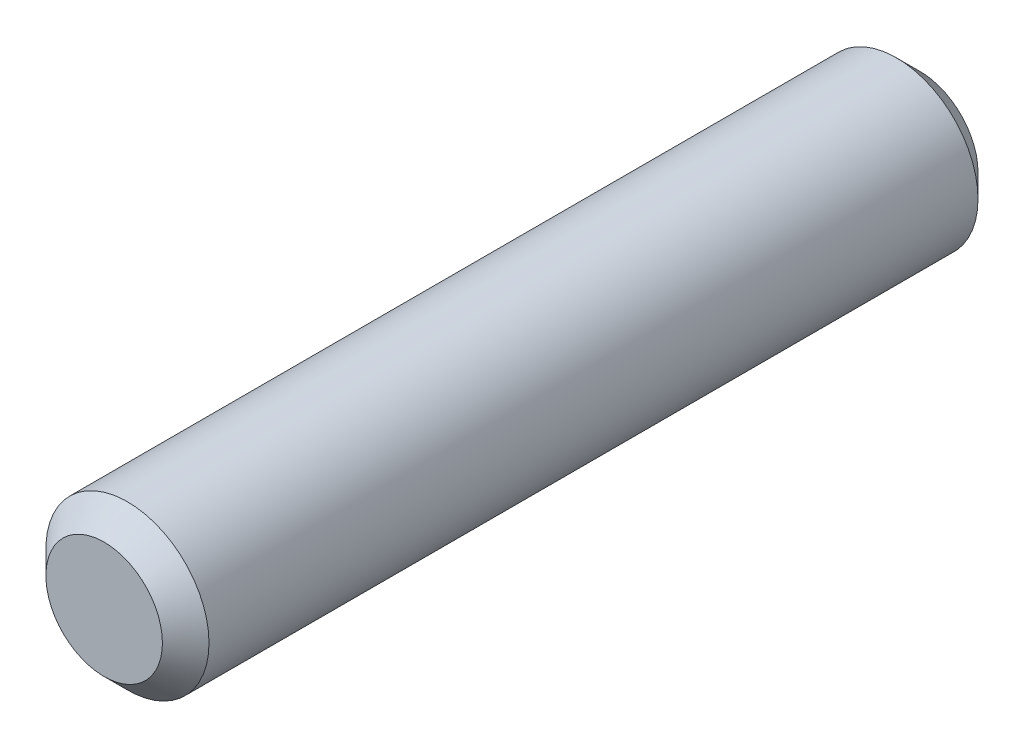
ISO-10303-21;
HEADER;
FILE_DESCRIPTION(('STEP AP214'),'2;1');
FILE_NAME('part.step','',(''),(''),'','','');
FILE_SCHEMA(('AUTOMOTIVE_DESIGN { 1 0 10303 214 1 1 1 1 }'));
ENDSEC;
DATA;
#1=APPLICATION_CONTEXT('core data for automotive mechanical design processes');
#2=APPLICATION_PROTOCOL_DEFINITION('international standard','automotive_design',2000,#1);
#3=PRODUCT_CONTEXT('',#1,'mechanical');
#4=PRODUCT('Part','Part','',(#3));
#5=PRODUCT_RELATED_PRODUCT_CATEGORY('part','',(#4));
#6=PRODUCT_DEFINITION_FORMATION('','',#4);
#7=PRODUCT_DEFINITION_CONTEXT('part definition',#1,'design');
#8=PRODUCT_DEFINITION('design','',#6,#7);
#9=PRODUCT_DEFINITION_SHAPE('','',#8);
#10=(LENGTH_UNIT() NAMED_UNIT(*) SI_UNIT(.MILLI.,.METRE.));
#11=(NAMED_UNIT(*) PLANE_ANGLE_UNIT() SI_UNIT($,.RADIAN.));
#12=(NAMED_UNIT(*) SI_UNIT($,.STERADIAN.) SOLID_ANGLE_UNIT());
#13=UNCERTAINTY_MEASURE_WITH_UNIT(LENGTH_MEASURE(1.E-05),#10,'distance_accuracy_value','');
#14=(GEOMETRIC_REPRESENTATION_CONTEXT(3) GLOBAL_UNCERTAINTY_ASSIGNED_CONTEXT((#13)) GLOBAL_UNIT_ASSIGNED_CONTEXT((#10,
#11,#12)) REPRESENTATION_CONTEXT('',''));
#15=CARTESIAN_POINT('',(0.,0.,0.));
#16=DIRECTION('',(0.,0.,1.));
#17=DIRECTION('',(1.,0.,0.));
#18=AXIS2_PLACEMENT_3D('',#15,#16,#17);
#19=CARTESIAN_POINT('',(0.,0.,70.));
#20=DIRECTION('',(0.,0.,-1.));
#21=DIRECTION('',(-1.,0.,0.));
#22=AXIS2_PLACEMENT_3D('',#19,#20,#21);
#23=CYLINDRICAL_SURFACE('',#22,7.);
#24=CARTESIAN_POINT('',(0.,0.,2.00000000000002));
#25=DIRECTION('',(0.,0.,1.));
#26=DIRECTION('',(1.,0.,0.));
#27=AXIS2_PLACEMENT_3D('',#24,#25,#26);
#28=CIRCLE('',#27,7.);
#29=CARTESIAN_POINT('',(7.,0.,2.00000000000002));
#30=VERTEX_POINT('',#29);
#31=EDGE_CURVE('E48',#30,#30,#28,.T.);
#32=ORIENTED_EDGE('',*,*,#31,.T.);
#33=EDGE_LOOP('',(#32));
#34=FACE_BOUND('',#33,.T.);
#35=CARTESIAN_POINT('',(0.,0.,68.));
#36=DIRECTION('',(0.,0.,1.));
#37=DIRECTION('',(1.,0.,0.));
#38=AXIS2_PLACEMENT_3D('',#35,#36,#37);
#39=CIRCLE('',#38,7.);
#40=CARTESIAN_POINT('',(7.,0.,68.));
#41=VERTEX_POINT('',#40);
#42=EDGE_CURVE('E53',#41,#41,#39,.F.);
#43=ORIENTED_EDGE('',*,*,#42,.T.);
#44=EDGE_LOOP('',(#43));
#45=FACE_BOUND('',#44,.T.);
#46=ADVANCED_FACE('F39',(#34,#45),#23,.T.);
#47=CARTESIAN_POINT('',(0.,0.,70.));
#48=DIRECTION('',(0.,0.,1.));
#49=DIRECTION('',(1.,0.,0.));
#50=AXIS2_PLACEMENT_3D('',#47,#48,#49);
#51=PLANE('',#50);
#52=CARTESIAN_POINT('',(0.,0.,70.));
#53=DIRECTION('',(0.,0.,1.));
#54=DIRECTION('',(1.,0.,0.));
#55=AXIS2_PLACEMENT_3D('',#52,#53,#54);
#56=CIRCLE('',#55,5.);
#57=CARTESIAN_POINT('',(5.,0.,70.));
#58=VERTEX_POINT('',#57);
#59=EDGE_CURVE('E58',#58,#58,#56,.T.);
#60=ORIENTED_EDGE('',*,*,#59,.T.);
#61=EDGE_LOOP('',(#60));
#62=FACE_BOUND('',#61,.T.);
#63=ADVANCED_FACE('F65',(#62),#51,.T.);
#64=CARTESIAN_POINT('',(0.,0.,0.));
#65=DIRECTION('',(0.,0.,1.));
#66=DIRECTION('',(1.,0.,0.));
#67=AXIS2_PLACEMENT_3D('',#64,#65,#66);
#68=PLANE('',#67);
#69=CARTESIAN_POINT('',(0.,0.,0.));
#70=DIRECTION('',(0.,0.,1.));
#71=DIRECTION('',(1.,0.,0.));
#72=AXIS2_PLACEMENT_3D('',#69,#70,#71);
#73=CIRCLE('',#72,4.99999999999998);
#74=CARTESIAN_POINT('',(4.99999999999998,0.,0.));
#75=VERTEX_POINT('',#74);
#76=EDGE_CURVE('E10',#75,#75,#73,.F.);
#77=ORIENTED_EDGE('',*,*,#76,.T.);
#78=EDGE_LOOP('',(#77));
#79=FACE_BOUND('',#78,.T.);
#80=ADVANCED_FACE('F69',(#79),#68,.F.);
#81=CARTESIAN_POINT('',(0.,0.,70.));
#82=DIRECTION('',(0.,0.,-1.));
#83=DIRECTION('',(-1.,0.,0.));
#84=AXIS2_PLACEMENT_3D('',#81,#82,#83);
#85=CONICAL_SURFACE('',#84,5.,0.785398163397452);
#86=ORIENTED_EDGE('',*,*,#42,.F.);
#87=EDGE_LOOP('',(#86));
#88=FACE_BOUND('',#87,.T.);
#89=ORIENTED_EDGE('',*,*,#59,.F.);
#90=EDGE_LOOP('',(#89));
#91=FACE_BOUND('',#90,.T.);
#92=ADVANCED_FACE('F67',(#88,#91),#85,.T.);
#93=CARTESIAN_POINT('',(0.,0.,2.00000000000002));
#94=DIRECTION('',(0.,0.,1.));
#95=DIRECTION('',(1.,0.,0.));
#96=AXIS2_PLACEMENT_3D('',#93,#94,#95);
#97=CONICAL_SURFACE('',#96,7.,0.78539816339745);
#98=ORIENTED_EDGE('',*,*,#76,.F.);
#99=EDGE_LOOP('',(#98));
#100=FACE_BOUND('',#99,.T.);
#101=ORIENTED_EDGE('',*,*,#31,.F.);
#102=EDGE_LOOP('',(#101));
#103=FACE_BOUND('',#102,.T.);
#104=ADVANCED_FACE('F42',(#100,#103),#97,.T.);
#105=CLOSED_SHELL('',(#46,#63,#80,#92,#104));
#106=MANIFOLD_SOLID_BREP('B2',#105);
#107=ADVANCED_BREP_SHAPE_REPRESENTATION('',(#18,#106),#14);
#108=SHAPE_DEFINITION_REPRESENTATION(#9,#107);
ENDSEC;
END-ISO-10303-21;
